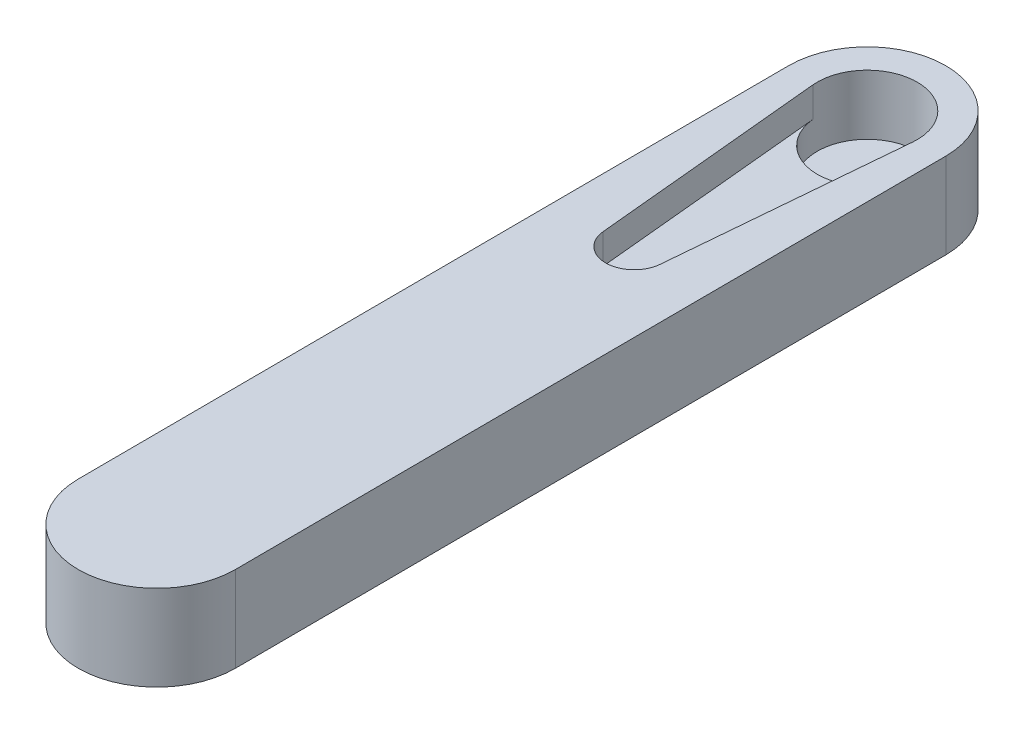
ISO-10303-21;
HEADER;
FILE_DESCRIPTION(('STEP AP214'),'2;1');
FILE_NAME('part.step','',(''),(''),'','','');
FILE_SCHEMA(('AUTOMOTIVE_DESIGN { 1 0 10303 214 1 1 1 1 }'));
ENDSEC;
DATA;
#1=APPLICATION_CONTEXT('core data for automotive mechanical design processes');
#2=APPLICATION_PROTOCOL_DEFINITION('international standard','automotive_design',2000,#1);
#3=PRODUCT_CONTEXT('',#1,'mechanical');
#4=PRODUCT('Part','Part','',(#3));
#5=PRODUCT_RELATED_PRODUCT_CATEGORY('part','',(#4));
#6=PRODUCT_DEFINITION_FORMATION('','',#4);
#7=PRODUCT_DEFINITION_CONTEXT('part definition',#1,'design');
#8=PRODUCT_DEFINITION('design','',#6,#7);
#9=PRODUCT_DEFINITION_SHAPE('','',#8);
#10=(LENGTH_UNIT() NAMED_UNIT(*) SI_UNIT(.MILLI.,.METRE.));
#11=(NAMED_UNIT(*) PLANE_ANGLE_UNIT() SI_UNIT($,.RADIAN.));
#12=(NAMED_UNIT(*) SI_UNIT($,.STERADIAN.) SOLID_ANGLE_UNIT());
#13=UNCERTAINTY_MEASURE_WITH_UNIT(LENGTH_MEASURE(1.E-05),#10,'distance_accuracy_value','');
#14=(GEOMETRIC_REPRESENTATION_CONTEXT(3) GLOBAL_UNCERTAINTY_ASSIGNED_CONTEXT((#13)) GLOBAL_UNIT_ASSIGNED_CONTEXT((#10,
#11,#12)) REPRESENTATION_CONTEXT('',''));
#15=CARTESIAN_POINT('',(0.,0.,0.));
#16=DIRECTION('',(0.,0.,1.));
#17=DIRECTION('',(1.,0.,0.));
#18=AXIS2_PLACEMENT_3D('',#15,#16,#17);
#19=CARTESIAN_POINT('',(-0.196386129317822,6.,-30.0319644524511));
#20=DIRECTION('',(0.,-1.,0.));
#21=DIRECTION('',(0.,0.,-1.));
#22=AXIS2_PLACEMENT_3D('',#19,#20,#21);
#23=CYLINDRICAL_SURFACE('',#22,5.5);
#24=CARTESIAN_POINT('',(-0.196386129317822,0.,-30.0319644524511));
#25=DIRECTION('',(0.,1.,0.));
#26=DIRECTION('',(0.,0.,-1.));
#27=AXIS2_PLACEMENT_3D('',#24,#25,#26);
#28=CIRCLE('',#27,5.5);
#29=CARTESIAN_POINT('',(5.30357142857142,0.,-30.0535714285714));
#30=VERTEX_POINT('',#29);
#31=CARTESIAN_POINT('',(-5.69634368720706,0.,-30.0103574763308));
#32=VERTEX_POINT('',#31);
#33=EDGE_CURVE('E132',#30,#32,#28,.T.);
#34=ORIENTED_EDGE('',*,*,#33,.T.);
#35=DIRECTION('',(0.,-1.,0.));
#36=VECTOR('',#35,1.);
#37=CARTESIAN_POINT('',(-5.69634368720706,6.,-30.0103574763308));
#38=LINE('',#37,#36);
#39=CARTESIAN_POINT('',(-5.69634368720706,6.,-30.0103574763308));
#40=VERTEX_POINT('',#39);
#41=EDGE_CURVE('E45',#40,#32,#38,.T.);
#42=ORIENTED_EDGE('',*,*,#41,.F.);
#43=CARTESIAN_POINT('',(-0.196386129317822,6.,-30.0319644524511));
#44=DIRECTION('',(0.,1.,0.));
#45=DIRECTION('',(0.,0.,-1.));
#46=AXIS2_PLACEMENT_3D('',#43,#44,#45);
#47=CIRCLE('',#46,5.5);
#48=CARTESIAN_POINT('',(5.30357142857142,6.,-30.0535714285714));
#49=VERTEX_POINT('',#48);
#50=EDGE_CURVE('E166',#49,#40,#47,.T.);
#51=ORIENTED_EDGE('',*,*,#50,.F.);
#52=DIRECTION('',(0.,-1.,0.));
#53=VECTOR('',#52,1.);
#54=CARTESIAN_POINT('',(5.30357142857142,6.,-30.0535714285714));
#55=LINE('',#54,#53);
#56=EDGE_CURVE('E176',#49,#30,#55,.T.);
#57=ORIENTED_EDGE('',*,*,#56,.T.);
#58=EDGE_LOOP('',(#34,#42,#51,#57));
#59=FACE_BOUND('',#58,.T.);
#60=ADVANCED_FACE('F42',(#59),#23,.T.);
#61=CARTESIAN_POINT('',(-5.69634368720706,6.,-30.0103574763308));
#62=DIRECTION('',(0.999992283252588,0.,-0.00392854111277828));
#63=DIRECTION('',(-0.00392854111277829,0.,-0.999992283252589));
#64=AXIS2_PLACEMENT_3D('',#61,#62,#63);
#65=PLANE('',#64);
#66=DIRECTION('',(0.00392854111277828,0.,0.999992283252588));
#67=VECTOR('',#66,1.);
#68=CARTESIAN_POINT('',(-5.69634368720706,0.,-30.0103574763308));
#69=LINE('',#68,#67);
#70=CARTESIAN_POINT('',(-5.49991511577848,0.,19.9896425236692));
#71=VERTEX_POINT('',#70);
#72=EDGE_CURVE('E180',#32,#71,#69,.T.);
#73=ORIENTED_EDGE('',*,*,#72,.T.);
#74=DIRECTION('',(0.,-1.,0.));
#75=VECTOR('',#74,1.);
#76=CARTESIAN_POINT('',(-5.49991511577848,6.,19.9896425236692));
#77=LINE('',#76,#75);
#78=CARTESIAN_POINT('',(-5.49991511577848,6.,19.9896425236692));
#79=VERTEX_POINT('',#78);
#80=EDGE_CURVE('E192',#79,#71,#77,.T.);
#81=ORIENTED_EDGE('',*,*,#80,.F.);
#82=DIRECTION('',(0.00392854111277828,0.,0.999992283252588));
#83=VECTOR('',#82,1.);
#84=CARTESIAN_POINT('',(-5.69634368720706,6.,-30.0103574763308));
#85=LINE('',#84,#83);
#86=EDGE_CURVE('E96',#40,#79,#85,.T.);
#87=ORIENTED_EDGE('',*,*,#86,.F.);
#88=ORIENTED_EDGE('',*,*,#41,.T.);
#89=EDGE_LOOP('',(#73,#81,#87,#88));
#90=FACE_BOUND('',#89,.T.);
#91=ADVANCED_FACE('F200',(#90),#65,.F.);
#92=CARTESIAN_POINT('',(4.2442110762507E-05,6.,19.9680355475489));
#93=DIRECTION('',(0.,-1.,0.));
#94=DIRECTION('',(0.,0.,-1.));
#95=AXIS2_PLACEMENT_3D('',#92,#93,#94);
#96=CYLINDRICAL_SURFACE('',#95,5.5);
#97=CARTESIAN_POINT('',(4.2442110762507E-05,0.,19.9680355475489));
#98=DIRECTION('',(0.,1.,0.));
#99=DIRECTION('',(0.,0.,1.));
#100=AXIS2_PLACEMENT_3D('',#97,#98,#99);
#101=CIRCLE('',#100,5.5);
#102=CARTESIAN_POINT('',(5.5,0.,19.9464285714286));
#103=VERTEX_POINT('',#102);
#104=EDGE_CURVE('E183',#71,#103,#101,.T.);
#105=ORIENTED_EDGE('',*,*,#104,.T.);
#106=DIRECTION('',(0.,-1.,0.));
#107=VECTOR('',#106,1.);
#108=CARTESIAN_POINT('',(5.5,6.,19.9464285714286));
#109=LINE('',#108,#107);
#110=CARTESIAN_POINT('',(5.5,6.,19.9464285714286));
#111=VERTEX_POINT('',#110);
#112=EDGE_CURVE('E190',#111,#103,#109,.T.);
#113=ORIENTED_EDGE('',*,*,#112,.F.);
#114=CARTESIAN_POINT('',(4.2442110762507E-05,6.,19.9680355475489));
#115=DIRECTION('',(0.,1.,0.));
#116=DIRECTION('',(0.,0.,1.));
#117=AXIS2_PLACEMENT_3D('',#114,#115,#116);
#118=CIRCLE('',#117,5.5);
#119=EDGE_CURVE('E171',#79,#111,#118,.T.);
#120=ORIENTED_EDGE('',*,*,#119,.F.);
#121=ORIENTED_EDGE('',*,*,#80,.T.);
#122=EDGE_LOOP('',(#105,#113,#120,#121));
#123=FACE_BOUND('',#122,.T.);
#124=ADVANCED_FACE('F207',(#123),#96,.T.);
#125=CARTESIAN_POINT('',(5.30357142857142,6.,-30.0535714285714));
#126=DIRECTION('',(-0.999992283252588,0.,0.00392854111277828));
#127=DIRECTION('',(0.00392854111277829,0.,0.999992283252589));
#128=AXIS2_PLACEMENT_3D('',#125,#126,#127);
#129=PLANE('',#128);
#130=DIRECTION('',(-0.00392854111277828,0.,-0.999992283252588));
#131=VECTOR('',#130,1.);
#132=CARTESIAN_POINT('',(5.30357142857142,0.,-30.0535714285714));
#133=LINE('',#132,#131);
#134=EDGE_CURVE('E88',#103,#30,#133,.T.);
#135=ORIENTED_EDGE('',*,*,#134,.T.);
#136=ORIENTED_EDGE('',*,*,#56,.F.);
#137=DIRECTION('',(-0.00392854111277828,0.,-0.999992283252588));
#138=VECTOR('',#137,1.);
#139=CARTESIAN_POINT('',(5.30357142857142,6.,-30.0535714285714));
#140=LINE('',#139,#138);
#141=EDGE_CURVE('E67',#111,#49,#140,.T.);
#142=ORIENTED_EDGE('',*,*,#141,.F.);
#143=ORIENTED_EDGE('',*,*,#112,.T.);
#144=EDGE_LOOP('',(#135,#136,#142,#143));
#145=FACE_BOUND('',#144,.T.);
#146=ADVANCED_FACE('F208',(#145),#129,.F.);
#147=CARTESIAN_POINT('',(-0.196386129317822,6.,-30.0319644524511));
#148=DIRECTION('',(0.,-1.,0.));
#149=DIRECTION('',(0.,0.,-1.));
#150=AXIS2_PLACEMENT_3D('',#147,#148,#149);
#151=PLANE('',#150);
#152=DIRECTION('',(0.0953738410689164,0.,0.995441525374425));
#153=VECTOR('',#152,1.);
#154=CARTESIAN_POINT('',(-3.68043146812831,6.,-29.6981560087099));
#155=LINE('',#154,#153);
#156=CARTESIAN_POINT('',(-3.68043146812831,6.,-29.6981560087099));
#157=VERTEX_POINT('',#156);
#158=CARTESIAN_POINT('',(-2.12284044190123,6.,-13.4411743282025));
#159=VERTEX_POINT('',#158);
#160=EDGE_CURVE('E151',#157,#159,#155,.T.);
#161=ORIENTED_EDGE('',*,*,#160,.F.);
#162=CARTESIAN_POINT('',(-0.196386129317822,6.,-30.0319644524511));
#163=DIRECTION('',(0.,1.,0.));
#164=DIRECTION('',(0.,0.,-1.));
#165=AXIS2_PLACEMENT_3D('',#162,#163,#164);
#166=CIRCLE('',#165,3.5);
#167=CARTESIAN_POINT('',(3.29017440806708,6.,-29.725540531795));
#168=VERTEX_POINT('',#167);
#169=EDGE_CURVE('E58',#168,#157,#166,.T.);
#170=ORIENTED_EDGE('',*,*,#169,.F.);
#171=DIRECTION('',(0.0875496916160434,0.,-0.996160153538544));
#172=VECTOR('',#171,1.);
#173=CARTESIAN_POINT('',(3.29017440806708,6.,-29.725540531795));
#174=LINE('',#173,#172);
#175=CARTESIAN_POINT('',(1.86036291592471,6.,-13.4568226271083));
#176=VERTEX_POINT('',#175);
#177=EDGE_CURVE('E130',#176,#168,#174,.T.);
#178=ORIENTED_EDGE('',*,*,#177,.F.);
#179=CARTESIAN_POINT('',(-0.131957391152381,6.,-13.6319220103404));
#180=DIRECTION('',(0.,1.,0.));
#181=DIRECTION('',(0.,0.,1.));
#182=AXIS2_PLACEMENT_3D('',#179,#180,#181);
#183=CIRCLE('',#182,2.);
#184=EDGE_CURVE('E156',#159,#176,#183,.T.);
#185=ORIENTED_EDGE('',*,*,#184,.F.);
#186=EDGE_LOOP('',(#161,#170,#178,#185));
#187=FACE_BOUND('',#186,.T.);
#188=ORIENTED_EDGE('',*,*,#50,.T.);
#189=ORIENTED_EDGE('',*,*,#86,.T.);
#190=ORIENTED_EDGE('',*,*,#119,.T.);
#191=ORIENTED_EDGE('',*,*,#141,.T.);
#192=EDGE_LOOP('',(#188,#189,#190,#191));
#193=FACE_BOUND('',#192,.T.);
#194=ADVANCED_FACE('F209',(#187,#193),#151,.F.);
#195=CARTESIAN_POINT('',(-0.196386129317822,0.,-30.0319644524511));
#196=DIRECTION('',(0.,-1.,0.));
#197=DIRECTION('',(0.,0.,-1.));
#198=AXIS2_PLACEMENT_3D('',#195,#196,#197);
#199=PLANE('',#198);
#200=ORIENTED_EDGE('',*,*,#33,.F.);
#201=ORIENTED_EDGE('',*,*,#134,.F.);
#202=ORIENTED_EDGE('',*,*,#104,.F.);
#203=ORIENTED_EDGE('',*,*,#72,.F.);
#204=EDGE_LOOP('',(#200,#201,#202,#203));
#205=FACE_BOUND('',#204,.T.);
#206=ADVANCED_FACE('F205',(#205),#199,.T.);
#207=CARTESIAN_POINT('',(-0.196386129317822,3.9,-30.0319644524511));
#208=DIRECTION('',(0.,1.,0.));
#209=DIRECTION('',(0.,0.,1.));
#210=AXIS2_PLACEMENT_3D('',#207,#208,#209);
#211=CYLINDRICAL_SURFACE('',#210,3.5);
#212=ORIENTED_EDGE('',*,*,#169,.T.);
#213=DIRECTION('',(0.,1.,0.));
#214=VECTOR('',#213,1.);
#215=CARTESIAN_POINT('',(-3.68043146812831,3.9,-29.6981560087099));
#216=LINE('',#215,#214);
#217=CARTESIAN_POINT('',(-3.68043146812831,3.9,-29.6981560087099));
#218=VERTEX_POINT('',#217);
#219=EDGE_CURVE('E120',#218,#157,#216,.T.);
#220=ORIENTED_EDGE('',*,*,#219,.F.);
#221=CARTESIAN_POINT('',(-0.196386129317822,3.9,-30.0319644524511));
#222=DIRECTION('',(0.,1.,0.));
#223=DIRECTION('',(0.,0.,1.));
#224=AXIS2_PLACEMENT_3D('',#221,#222,#223);
#225=CIRCLE('',#224,3.5);
#226=CARTESIAN_POINT('',(3.29017440806708,3.9,-29.725540531795));
#227=VERTEX_POINT('',#226);
#228=EDGE_CURVE('E11',#218,#227,#225,.T.);
#229=ORIENTED_EDGE('',*,*,#228,.T.);
#230=DIRECTION('',(0.,1.,0.));
#231=VECTOR('',#230,1.);
#232=CARTESIAN_POINT('',(3.29017440806708,3.9,-29.725540531795));
#233=LINE('',#232,#231);
#234=EDGE_CURVE('E118',#227,#168,#233,.T.);
#235=ORIENTED_EDGE('',*,*,#234,.T.);
#236=EDGE_LOOP('',(#212,#220,#229,#235));
#237=FACE_BOUND('',#236,.T.);
#238=CARTESIAN_POINT('',(-0.196386129317822,1.8,-30.0319644524511));
#239=DIRECTION('',(0.,1.,0.));
#240=DIRECTION('',(0.,0.,1.));
#241=AXIS2_PLACEMENT_3D('',#238,#239,#240);
#242=CIRCLE('',#241,3.5);
#243=CARTESIAN_POINT('',(-0.196386129317822,1.8,-26.5319644524511));
#244=VERTEX_POINT('',#243);
#245=EDGE_CURVE('E152',#244,#244,#242,.T.);
#246=ORIENTED_EDGE('',*,*,#245,.F.);
#247=EDGE_LOOP('',(#246));
#248=FACE_BOUND('',#247,.T.);
#249=ADVANCED_FACE('F116',(#237,#248),#211,.F.);
#250=CARTESIAN_POINT('',(3.29017440806708,3.9,-29.725540531795));
#251=DIRECTION('',(0.996160153538544,0.,0.0875496916160435));
#252=DIRECTION('',(0.0875496916160435,0.,-0.996160153538544));
#253=AXIS2_PLACEMENT_3D('',#250,#251,#252);
#254=PLANE('',#253);
#255=ORIENTED_EDGE('',*,*,#177,.T.);
#256=ORIENTED_EDGE('',*,*,#234,.F.);
#257=DIRECTION('',(0.0875496916160434,0.,-0.996160153538544));
#258=VECTOR('',#257,1.);
#259=CARTESIAN_POINT('',(3.29017440806708,3.9,-29.725540531795));
#260=LINE('',#259,#258);
#261=CARTESIAN_POINT('',(1.86036291592471,3.9,-13.4568226271083));
#262=VERTEX_POINT('',#261);
#263=EDGE_CURVE('E128',#262,#227,#260,.T.);
#264=ORIENTED_EDGE('',*,*,#263,.F.);
#265=DIRECTION('',(0.,1.,0.));
#266=VECTOR('',#265,1.);
#267=CARTESIAN_POINT('',(1.86036291592471,3.9,-13.4568226271083));
#268=LINE('',#267,#266);
#269=EDGE_CURVE('E133',#262,#176,#268,.T.);
#270=ORIENTED_EDGE('',*,*,#269,.T.);
#271=EDGE_LOOP('',(#255,#256,#264,#270));
#272=FACE_BOUND('',#271,.T.);
#273=ADVANCED_FACE('F127',(#272),#254,.F.);
#274=CARTESIAN_POINT('',(-0.131957391152381,3.9,-13.6319220103404));
#275=DIRECTION('',(0.,1.,0.));
#276=DIRECTION('',(0.,0.,1.));
#277=AXIS2_PLACEMENT_3D('',#274,#275,#276);
#278=CYLINDRICAL_SURFACE('',#277,2.);
#279=ORIENTED_EDGE('',*,*,#184,.T.);
#280=ORIENTED_EDGE('',*,*,#269,.F.);
#281=CARTESIAN_POINT('',(-0.131957391152381,3.9,-13.6319220103404));
#282=DIRECTION('',(0.,1.,0.));
#283=DIRECTION('',(0.,0.,1.));
#284=AXIS2_PLACEMENT_3D('',#281,#282,#283);
#285=CIRCLE('',#284,2.);
#286=CARTESIAN_POINT('',(-2.12284044190123,3.9,-13.4411743282025));
#287=VERTEX_POINT('',#286);
#288=EDGE_CURVE('E138',#287,#262,#285,.T.);
#289=ORIENTED_EDGE('',*,*,#288,.F.);
#290=DIRECTION('',(0.,1.,0.));
#291=VECTOR('',#290,1.);
#292=CARTESIAN_POINT('',(-2.12284044190123,3.9,-13.4411743282025));
#293=LINE('',#292,#291);
#294=EDGE_CURVE('E143',#287,#159,#293,.T.);
#295=ORIENTED_EDGE('',*,*,#294,.T.);
#296=EDGE_LOOP('',(#279,#280,#289,#295));
#297=FACE_BOUND('',#296,.T.);
#298=ADVANCED_FACE('F255',(#297),#278,.F.);
#299=CARTESIAN_POINT('',(-3.68043146812831,3.9,-29.6981560087099));
#300=DIRECTION('',(-0.995441525374424,0.,0.0953738410689164));
#301=DIRECTION('',(0.0953738410689164,0.,0.995441525374425));
#302=AXIS2_PLACEMENT_3D('',#299,#300,#301);
#303=PLANE('',#302);
#304=ORIENTED_EDGE('',*,*,#160,.T.);
#305=ORIENTED_EDGE('',*,*,#294,.F.);
#306=DIRECTION('',(0.0953738410689164,0.,0.995441525374425));
#307=VECTOR('',#306,1.);
#308=CARTESIAN_POINT('',(-3.68043146812831,3.9,-29.6981560087099));
#309=LINE('',#308,#307);
#310=EDGE_CURVE('E145',#218,#287,#309,.T.);
#311=ORIENTED_EDGE('',*,*,#310,.F.);
#312=ORIENTED_EDGE('',*,*,#219,.T.);
#313=EDGE_LOOP('',(#304,#305,#311,#312));
#314=FACE_BOUND('',#313,.T.);
#315=ADVANCED_FACE('F260',(#314),#303,.F.);
#316=CARTESIAN_POINT('',(-0.196386129317822,3.9,-30.0319644524511));
#317=DIRECTION('',(0.,-1.,0.));
#318=DIRECTION('',(0.,0.,-1.));
#319=AXIS2_PLACEMENT_3D('',#316,#317,#318);
#320=PLANE('',#319);
#321=ORIENTED_EDGE('',*,*,#228,.F.);
#322=ORIENTED_EDGE('',*,*,#310,.T.);
#323=ORIENTED_EDGE('',*,*,#288,.T.);
#324=ORIENTED_EDGE('',*,*,#263,.T.);
#325=EDGE_LOOP('',(#321,#322,#323,#324));
#326=FACE_BOUND('',#325,.T.);
#327=ADVANCED_FACE('F136',(#326),#320,.F.);
#328=CARTESIAN_POINT('',(-0.196386129317822,1.8,-30.0319644524511));
#329=DIRECTION('',(0.,1.,0.));
#330=DIRECTION('',(0.,0.,1.));
#331=AXIS2_PLACEMENT_3D('',#328,#329,#330);
#332=PLANE('',#331);
#333=ORIENTED_EDGE('',*,*,#245,.T.);
#334=EDGE_LOOP('',(#333));
#335=FACE_BOUND('',#334,.T.);
#336=ADVANCED_FACE('F297',(#335),#332,.T.);
#337=CLOSED_SHELL('',(#60,#91,#124,#146,#194,#206,#249,#273,#298,#315,#327,#336));
#338=MANIFOLD_SOLID_BREP('B2',#337);
#339=ADVANCED_BREP_SHAPE_REPRESENTATION('',(#18,#338),#14);
#340=SHAPE_DEFINITION_REPRESENTATION(#9,#339);
ENDSEC;
END-ISO-10303-21;
